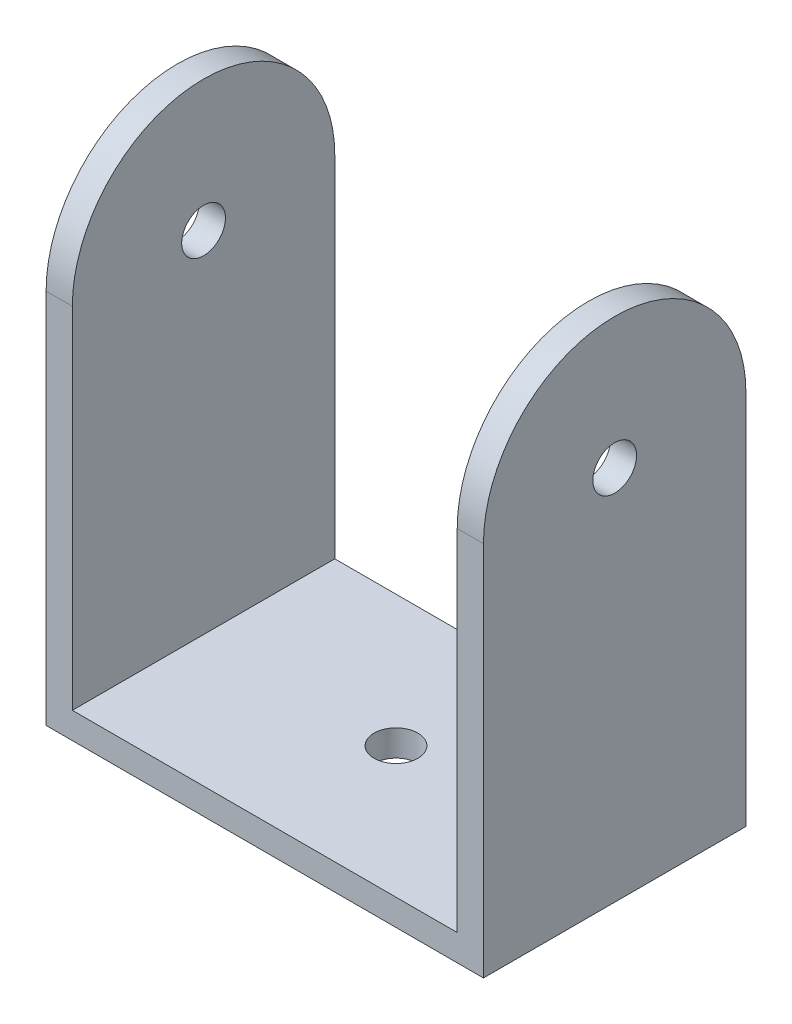
ISO-10303-21;
HEADER;
FILE_DESCRIPTION(('STEP AP214'),'2;1');
FILE_NAME('part.step','',(''),(''),'','','');
FILE_SCHEMA(('AUTOMOTIVE_DESIGN { 1 0 10303 214 1 1 1 1 }'));
ENDSEC;
DATA;
#1=APPLICATION_CONTEXT('core data for automotive mechanical design processes');
#2=APPLICATION_PROTOCOL_DEFINITION('international standard','automotive_design',2000,#1);
#3=PRODUCT_CONTEXT('',#1,'mechanical');
#4=PRODUCT('Part','Part','',(#3));
#5=PRODUCT_RELATED_PRODUCT_CATEGORY('part','',(#4));
#6=PRODUCT_DEFINITION_FORMATION('','',#4);
#7=PRODUCT_DEFINITION_CONTEXT('part definition',#1,'design');
#8=PRODUCT_DEFINITION('design','',#6,#7);
#9=PRODUCT_DEFINITION_SHAPE('','',#8);
#10=(LENGTH_UNIT() NAMED_UNIT(*) SI_UNIT(.MILLI.,.METRE.));
#11=(NAMED_UNIT(*) PLANE_ANGLE_UNIT() SI_UNIT($,.RADIAN.));
#12=(NAMED_UNIT(*) SI_UNIT($,.STERADIAN.) SOLID_ANGLE_UNIT());
#13=UNCERTAINTY_MEASURE_WITH_UNIT(LENGTH_MEASURE(1.E-05),#10,'distance_accuracy_value','');
#14=(GEOMETRIC_REPRESENTATION_CONTEXT(3) GLOBAL_UNCERTAINTY_ASSIGNED_CONTEXT((#13)) GLOBAL_UNIT_ASSIGNED_CONTEXT((#10,
#11,#12)) REPRESENTATION_CONTEXT('',''));
#15=CARTESIAN_POINT('',(0.,0.,0.));
#16=DIRECTION('',(0.,0.,1.));
#17=DIRECTION('',(1.,0.,0.));
#18=AXIS2_PLACEMENT_3D('',#15,#16,#17);
#19=CARTESIAN_POINT('',(0.,3.,0.));
#20=DIRECTION('',(0.,1.,0.));
#21=DIRECTION('',(0.,0.,1.));
#22=AXIS2_PLACEMENT_3D('',#19,#20,#21);
#23=PLANE('',#22);
#24=CARTESIAN_POINT('',(0.,3.,0.));
#25=DIRECTION('',(0.,1.,0.));
#26=DIRECTION('',(0.,0.,1.));
#27=AXIS2_PLACEMENT_3D('',#24,#25,#26);
#28=CIRCLE('',#27,2.5);
#29=CARTESIAN_POINT('',(0.,3.,2.5));
#30=VERTEX_POINT('',#29);
#31=EDGE_CURVE('E209',#30,#30,#28,.T.);
#32=ORIENTED_EDGE('',*,*,#31,.F.);
#33=EDGE_LOOP('',(#32));
#34=FACE_BOUND('',#33,.T.);
#35=DIRECTION('',(-1.,0.,0.));
#36=VECTOR('',#35,1.);
#37=CARTESIAN_POINT('',(-25.,3.,-15.));
#38=LINE('',#37,#36);
#39=CARTESIAN_POINT('',(22.,3.,-15.));
#40=VERTEX_POINT('',#39);
#41=CARTESIAN_POINT('',(-22.,3.,-15.));
#42=VERTEX_POINT('',#41);
#43=EDGE_CURVE('E55',#40,#42,#38,.T.);
#44=ORIENTED_EDGE('',*,*,#43,.T.);
#45=DIRECTION('',(0.,0.,-1.));
#46=VECTOR('',#45,1.);
#47=CARTESIAN_POINT('',(-22.,3.,-15.));
#48=LINE('',#47,#46);
#49=CARTESIAN_POINT('',(-22.,3.,15.));
#50=VERTEX_POINT('',#49);
#51=EDGE_CURVE('E50',#50,#42,#48,.T.);
#52=ORIENTED_EDGE('',*,*,#51,.F.);
#53=DIRECTION('',(1.,0.,0.));
#54=VECTOR('',#53,1.);
#55=CARTESIAN_POINT('',(-25.,3.,15.));
#56=LINE('',#55,#54);
#57=CARTESIAN_POINT('',(22.,3.,15.));
#58=VERTEX_POINT('',#57);
#59=EDGE_CURVE('E36',#50,#58,#56,.T.);
#60=ORIENTED_EDGE('',*,*,#59,.T.);
#61=DIRECTION('',(0.,0.,-1.));
#62=VECTOR('',#61,1.);
#63=CARTESIAN_POINT('',(22.,3.,-15.));
#64=LINE('',#63,#62);
#65=EDGE_CURVE('E142',#58,#40,#64,.T.);
#66=ORIENTED_EDGE('',*,*,#65,.T.);
#67=EDGE_LOOP('',(#44,#52,#60,#66));
#68=FACE_BOUND('',#67,.T.);
#69=ADVANCED_FACE('F32',(#34,#68),#23,.T.);
#70=CARTESIAN_POINT('',(-25.,3.,-15.));
#71=DIRECTION('',(1.,0.,0.));
#72=DIRECTION('',(0.,0.,-1.));
#73=AXIS2_PLACEMENT_3D('',#70,#71,#72);
#74=PLANE('',#73);
#75=DIRECTION('',(0.,0.,1.));
#76=VECTOR('',#75,1.);
#77=CARTESIAN_POINT('',(-25.,0.,-15.));
#78=LINE('',#77,#76);
#79=CARTESIAN_POINT('',(-25.,0.,-15.));
#80=VERTEX_POINT('',#79);
#81=CARTESIAN_POINT('',(-25.,0.,15.));
#82=VERTEX_POINT('',#81);
#83=EDGE_CURVE('E193',#80,#82,#78,.T.);
#84=ORIENTED_EDGE('',*,*,#83,.T.);
#85=DIRECTION('',(0.,-1.,0.));
#86=VECTOR('',#85,1.);
#87=CARTESIAN_POINT('',(-25.,3.,15.));
#88=LINE('',#87,#86);
#89=CARTESIAN_POINT('',(-25.,43.,15.));
#90=VERTEX_POINT('',#89);
#91=EDGE_CURVE('E11',#90,#82,#88,.T.);
#92=ORIENTED_EDGE('',*,*,#91,.F.);
#93=CARTESIAN_POINT('',(-25.,43.,0.));
#94=DIRECTION('',(1.,0.,0.));
#95=DIRECTION('',(0.,0.,-1.));
#96=AXIS2_PLACEMENT_3D('',#93,#94,#95);
#97=CIRCLE('',#96,15.);
#98=CARTESIAN_POINT('',(-25.,43.,-15.));
#99=VERTEX_POINT('',#98);
#100=EDGE_CURVE('E116',#99,#90,#97,.T.);
#101=ORIENTED_EDGE('',*,*,#100,.F.);
#102=DIRECTION('',(0.,-1.,0.));
#103=VECTOR('',#102,1.);
#104=CARTESIAN_POINT('',(-25.,3.,-15.));
#105=LINE('',#104,#103);
#106=EDGE_CURVE('E170',#99,#80,#105,.T.);
#107=ORIENTED_EDGE('',*,*,#106,.T.);
#108=EDGE_LOOP('',(#84,#92,#101,#107));
#109=FACE_BOUND('',#108,.T.);
#110=CARTESIAN_POINT('',(-25.,43.,0.));
#111=DIRECTION('',(1.,0.,0.));
#112=DIRECTION('',(0.,0.,-1.));
#113=AXIS2_PLACEMENT_3D('',#110,#111,#112);
#114=CIRCLE('',#113,2.5);
#115=CARTESIAN_POINT('',(-25.,43.,-2.5));
#116=VERTEX_POINT('',#115);
#117=EDGE_CURVE('E203',#116,#116,#114,.T.);
#118=ORIENTED_EDGE('',*,*,#117,.T.);
#119=EDGE_LOOP('',(#118));
#120=FACE_BOUND('',#119,.T.);
#121=ADVANCED_FACE('F34',(#109,#120),#74,.F.);
#122=CARTESIAN_POINT('',(-25.,3.,15.));
#123=DIRECTION('',(0.,0.,-1.));
#124=DIRECTION('',(-1.,0.,0.));
#125=AXIS2_PLACEMENT_3D('',#122,#123,#124);
#126=PLANE('',#125);
#127=DIRECTION('',(1.,0.,0.));
#128=VECTOR('',#127,1.);
#129=CARTESIAN_POINT('',(-25.,0.,15.));
#130=LINE('',#129,#128);
#131=CARTESIAN_POINT('',(25.,0.,15.));
#132=VERTEX_POINT('',#131);
#133=EDGE_CURVE('E179',#82,#132,#130,.T.);
#134=ORIENTED_EDGE('',*,*,#133,.T.);
#135=DIRECTION('',(0.,-1.,0.));
#136=VECTOR('',#135,1.);
#137=CARTESIAN_POINT('',(25.,3.,15.));
#138=LINE('',#137,#136);
#139=CARTESIAN_POINT('',(25.,43.,15.));
#140=VERTEX_POINT('',#139);
#141=EDGE_CURVE('E42',#140,#132,#138,.T.);
#142=ORIENTED_EDGE('',*,*,#141,.F.);
#143=DIRECTION('',(1.,0.,0.));
#144=VECTOR('',#143,1.);
#145=CARTESIAN_POINT('',(22.,43.,15.));
#146=LINE('',#145,#144);
#147=CARTESIAN_POINT('',(22.,43.,15.));
#148=VERTEX_POINT('',#147);
#149=EDGE_CURVE('E156',#148,#140,#146,.T.);
#150=ORIENTED_EDGE('',*,*,#149,.F.);
#151=DIRECTION('',(0.,-1.,0.));
#152=VECTOR('',#151,1.);
#153=CARTESIAN_POINT('',(22.,3.,15.));
#154=LINE('',#153,#152);
#155=EDGE_CURVE('E151',#148,#58,#154,.T.);
#156=ORIENTED_EDGE('',*,*,#155,.T.);
#157=ORIENTED_EDGE('',*,*,#59,.F.);
#158=DIRECTION('',(0.,-1.,0.));
#159=VECTOR('',#158,1.);
#160=CARTESIAN_POINT('',(-22.,3.,15.));
#161=LINE('',#160,#159);
#162=CARTESIAN_POINT('',(-22.,43.,15.));
#163=VERTEX_POINT('',#162);
#164=EDGE_CURVE('E105',#163,#50,#161,.T.);
#165=ORIENTED_EDGE('',*,*,#164,.F.);
#166=DIRECTION('',(-1.,0.,0.));
#167=VECTOR('',#166,1.);
#168=CARTESIAN_POINT('',(-22.,43.,15.));
#169=LINE('',#168,#167);
#170=EDGE_CURVE('E113',#163,#90,#169,.T.);
#171=ORIENTED_EDGE('',*,*,#170,.T.);
#172=ORIENTED_EDGE('',*,*,#91,.T.);
#173=EDGE_LOOP('',(#134,#142,#150,#156,#157,#165,#171,#172));
#174=FACE_BOUND('',#173,.T.);
#175=ADVANCED_FACE('F120',(#174),#126,.F.);
#176=CARTESIAN_POINT('',(25.,3.,-15.));
#177=DIRECTION('',(-1.,0.,0.));
#178=DIRECTION('',(0.,0.,1.));
#179=AXIS2_PLACEMENT_3D('',#176,#177,#178);
#180=PLANE('',#179);
#181=DIRECTION('',(0.,0.,-1.));
#182=VECTOR('',#181,1.);
#183=CARTESIAN_POINT('',(25.,0.,-15.));
#184=LINE('',#183,#182);
#185=CARTESIAN_POINT('',(25.,0.,-15.));
#186=VERTEX_POINT('',#185);
#187=EDGE_CURVE('E175',#132,#186,#184,.T.);
#188=ORIENTED_EDGE('',*,*,#187,.T.);
#189=DIRECTION('',(0.,-1.,0.));
#190=VECTOR('',#189,1.);
#191=CARTESIAN_POINT('',(25.,3.,-15.));
#192=LINE('',#191,#190);
#193=CARTESIAN_POINT('',(25.,43.,-15.));
#194=VERTEX_POINT('',#193);
#195=EDGE_CURVE('E172',#194,#186,#192,.T.);
#196=ORIENTED_EDGE('',*,*,#195,.F.);
#197=CARTESIAN_POINT('',(25.,43.,0.));
#198=DIRECTION('',(1.,0.,0.));
#199=DIRECTION('',(0.,0.,-1.));
#200=AXIS2_PLACEMENT_3D('',#197,#198,#199);
#201=CIRCLE('',#200,15.);
#202=EDGE_CURVE('E134',#194,#140,#201,.T.);
#203=ORIENTED_EDGE('',*,*,#202,.T.);
#204=ORIENTED_EDGE('',*,*,#141,.T.);
#205=EDGE_LOOP('',(#188,#196,#203,#204));
#206=FACE_BOUND('',#205,.T.);
#207=CARTESIAN_POINT('',(25.,43.,0.));
#208=DIRECTION('',(1.,0.,0.));
#209=DIRECTION('',(0.,0.,-1.));
#210=AXIS2_PLACEMENT_3D('',#207,#208,#209);
#211=CIRCLE('',#210,2.5);
#212=CARTESIAN_POINT('',(25.,43.,-2.5));
#213=VERTEX_POINT('',#212);
#214=EDGE_CURVE('E129',#213,#213,#211,.T.);
#215=ORIENTED_EDGE('',*,*,#214,.F.);
#216=EDGE_LOOP('',(#215));
#217=FACE_BOUND('',#216,.T.);
#218=ADVANCED_FACE('F187',(#206,#217),#180,.F.);
#219=CARTESIAN_POINT('',(-25.,3.,-15.));
#220=DIRECTION('',(0.,0.,1.));
#221=DIRECTION('',(1.,0.,0.));
#222=AXIS2_PLACEMENT_3D('',#219,#220,#221);
#223=PLANE('',#222);
#224=DIRECTION('',(-1.,0.,0.));
#225=VECTOR('',#224,1.);
#226=CARTESIAN_POINT('',(-25.,0.,-15.));
#227=LINE('',#226,#225);
#228=EDGE_CURVE('E174',#186,#80,#227,.T.);
#229=ORIENTED_EDGE('',*,*,#228,.T.);
#230=ORIENTED_EDGE('',*,*,#106,.F.);
#231=DIRECTION('',(-1.,0.,0.));
#232=VECTOR('',#231,1.);
#233=CARTESIAN_POINT('',(-22.,43.,-15.));
#234=LINE('',#233,#232);
#235=CARTESIAN_POINT('',(-22.,43.,-15.));
#236=VERTEX_POINT('',#235);
#237=EDGE_CURVE('E118',#236,#99,#234,.T.);
#238=ORIENTED_EDGE('',*,*,#237,.F.);
#239=DIRECTION('',(0.,1.,0.));
#240=VECTOR('',#239,1.);
#241=CARTESIAN_POINT('',(-22.,43.,-15.));
#242=LINE('',#241,#240);
#243=EDGE_CURVE('E106',#42,#236,#242,.T.);
#244=ORIENTED_EDGE('',*,*,#243,.F.);
#245=ORIENTED_EDGE('',*,*,#43,.F.);
#246=DIRECTION('',(0.,1.,0.));
#247=VECTOR('',#246,1.);
#248=CARTESIAN_POINT('',(22.,43.,-15.));
#249=LINE('',#248,#247);
#250=CARTESIAN_POINT('',(22.,43.,-15.));
#251=VERTEX_POINT('',#250);
#252=EDGE_CURVE('E145',#40,#251,#249,.T.);
#253=ORIENTED_EDGE('',*,*,#252,.T.);
#254=DIRECTION('',(1.,0.,0.));
#255=VECTOR('',#254,1.);
#256=CARTESIAN_POINT('',(22.,43.,-15.));
#257=LINE('',#256,#255);
#258=EDGE_CURVE('E152',#251,#194,#257,.T.);
#259=ORIENTED_EDGE('',*,*,#258,.T.);
#260=ORIENTED_EDGE('',*,*,#195,.T.);
#261=EDGE_LOOP('',(#229,#230,#238,#244,#245,#253,#259,#260));
#262=FACE_BOUND('',#261,.T.);
#263=ADVANCED_FACE('F169',(#262),#223,.F.);
#264=CARTESIAN_POINT('',(0.,0.,0.));
#265=DIRECTION('',(0.,1.,0.));
#266=DIRECTION('',(0.,0.,1.));
#267=AXIS2_PLACEMENT_3D('',#264,#265,#266);
#268=PLANE('',#267);
#269=CARTESIAN_POINT('',(0.,0.,0.));
#270=DIRECTION('',(0.,1.,0.));
#271=DIRECTION('',(0.,0.,1.));
#272=AXIS2_PLACEMENT_3D('',#269,#270,#271);
#273=CIRCLE('',#272,2.5);
#274=CARTESIAN_POINT('',(0.,0.,2.5));
#275=VERTEX_POINT('',#274);
#276=EDGE_CURVE('E205',#275,#275,#273,.T.);
#277=ORIENTED_EDGE('',*,*,#276,.T.);
#278=EDGE_LOOP('',(#277));
#279=FACE_BOUND('',#278,.T.);
#280=ORIENTED_EDGE('',*,*,#83,.F.);
#281=ORIENTED_EDGE('',*,*,#228,.F.);
#282=ORIENTED_EDGE('',*,*,#187,.F.);
#283=ORIENTED_EDGE('',*,*,#133,.F.);
#284=EDGE_LOOP('',(#280,#281,#282,#283));
#285=FACE_BOUND('',#284,.T.);
#286=ADVANCED_FACE('F191',(#279,#285),#268,.F.);
#287=CARTESIAN_POINT('',(22.,43.,0.));
#288=DIRECTION('',(1.,0.,0.));
#289=DIRECTION('',(0.,0.,-1.));
#290=AXIS2_PLACEMENT_3D('',#287,#288,#289);
#291=CYLINDRICAL_SURFACE('',#290,15.);
#292=ORIENTED_EDGE('',*,*,#202,.F.);
#293=ORIENTED_EDGE('',*,*,#258,.F.);
#294=CARTESIAN_POINT('',(22.,43.,0.));
#295=DIRECTION('',(1.,0.,0.));
#296=DIRECTION('',(0.,0.,-1.));
#297=AXIS2_PLACEMENT_3D('',#294,#295,#296);
#298=CIRCLE('',#297,15.);
#299=EDGE_CURVE('E139',#251,#148,#298,.T.);
#300=ORIENTED_EDGE('',*,*,#299,.T.);
#301=ORIENTED_EDGE('',*,*,#149,.T.);
#302=EDGE_LOOP('',(#292,#293,#300,#301));
#303=FACE_BOUND('',#302,.T.);
#304=ADVANCED_FACE('F163',(#303),#291,.T.);
#305=CARTESIAN_POINT('',(22.,43.,0.));
#306=DIRECTION('',(1.,0.,0.));
#307=DIRECTION('',(0.,0.,-1.));
#308=AXIS2_PLACEMENT_3D('',#305,#306,#307);
#309=PLANE('',#308);
#310=CARTESIAN_POINT('',(22.,43.,0.));
#311=DIRECTION('',(1.,0.,0.));
#312=DIRECTION('',(0.,0.,-1.));
#313=AXIS2_PLACEMENT_3D('',#310,#311,#312);
#314=CIRCLE('',#313,2.5);
#315=CARTESIAN_POINT('',(22.,43.,-2.5));
#316=VERTEX_POINT('',#315);
#317=EDGE_CURVE('E131',#316,#316,#314,.T.);
#318=ORIENTED_EDGE('',*,*,#317,.T.);
#319=EDGE_LOOP('',(#318));
#320=FACE_BOUND('',#319,.T.);
#321=ORIENTED_EDGE('',*,*,#65,.F.);
#322=ORIENTED_EDGE('',*,*,#155,.F.);
#323=ORIENTED_EDGE('',*,*,#299,.F.);
#324=ORIENTED_EDGE('',*,*,#252,.F.);
#325=EDGE_LOOP('',(#321,#322,#323,#324));
#326=FACE_BOUND('',#325,.T.);
#327=ADVANCED_FACE('F167',(#320,#326),#309,.F.);
#328=CARTESIAN_POINT('',(22.,43.,0.));
#329=DIRECTION('',(1.,0.,0.));
#330=DIRECTION('',(0.,0.,-1.));
#331=AXIS2_PLACEMENT_3D('',#328,#329,#330);
#332=CYLINDRICAL_SURFACE('',#331,2.5);
#333=ORIENTED_EDGE('',*,*,#317,.F.);
#334=EDGE_LOOP('',(#333));
#335=FACE_BOUND('',#334,.T.);
#336=ORIENTED_EDGE('',*,*,#214,.T.);
#337=EDGE_LOOP('',(#336));
#338=FACE_BOUND('',#337,.T.);
#339=ADVANCED_FACE('F260',(#335,#338),#332,.F.);
#340=CARTESIAN_POINT('',(-22.,43.,0.));
#341=DIRECTION('',(-1.,0.,0.));
#342=DIRECTION('',(0.,0.,-1.));
#343=AXIS2_PLACEMENT_3D('',#340,#341,#342);
#344=PLANE('',#343);
#345=ORIENTED_EDGE('',*,*,#51,.T.);
#346=ORIENTED_EDGE('',*,*,#243,.T.);
#347=CARTESIAN_POINT('',(-22.,43.,0.));
#348=DIRECTION('',(1.,0.,0.));
#349=DIRECTION('',(0.,0.,-1.));
#350=AXIS2_PLACEMENT_3D('',#347,#348,#349);
#351=CIRCLE('',#350,15.);
#352=EDGE_CURVE('E100',#236,#163,#351,.T.);
#353=ORIENTED_EDGE('',*,*,#352,.T.);
#354=ORIENTED_EDGE('',*,*,#164,.T.);
#355=EDGE_LOOP('',(#345,#346,#353,#354));
#356=FACE_BOUND('',#355,.T.);
#357=CARTESIAN_POINT('',(-22.,43.,0.));
#358=DIRECTION('',(1.,0.,0.));
#359=DIRECTION('',(0.,0.,-1.));
#360=AXIS2_PLACEMENT_3D('',#357,#358,#359);
#361=CIRCLE('',#360,2.5);
#362=CARTESIAN_POINT('',(-22.,43.,-2.5));
#363=VERTEX_POINT('',#362);
#364=EDGE_CURVE('E128',#363,#363,#361,.T.);
#365=ORIENTED_EDGE('',*,*,#364,.F.);
#366=EDGE_LOOP('',(#365));
#367=FACE_BOUND('',#366,.T.);
#368=ADVANCED_FACE('F102',(#356,#367),#344,.F.);
#369=CARTESIAN_POINT('',(-22.,43.,0.));
#370=DIRECTION('',(-1.,0.,0.));
#371=DIRECTION('',(0.,0.,1.));
#372=AXIS2_PLACEMENT_3D('',#369,#370,#371);
#373=CYLINDRICAL_SURFACE('',#372,15.);
#374=ORIENTED_EDGE('',*,*,#100,.T.);
#375=ORIENTED_EDGE('',*,*,#170,.F.);
#376=ORIENTED_EDGE('',*,*,#352,.F.);
#377=ORIENTED_EDGE('',*,*,#237,.T.);
#378=EDGE_LOOP('',(#374,#375,#376,#377));
#379=FACE_BOUND('',#378,.T.);
#380=ADVANCED_FACE('F114',(#379),#373,.T.);
#381=CARTESIAN_POINT('',(-22.,43.,0.));
#382=DIRECTION('',(-1.,0.,0.));
#383=DIRECTION('',(0.,0.,1.));
#384=AXIS2_PLACEMENT_3D('',#381,#382,#383);
#385=CYLINDRICAL_SURFACE('',#384,2.5);
#386=ORIENTED_EDGE('',*,*,#364,.T.);
#387=EDGE_LOOP('',(#386));
#388=FACE_BOUND('',#387,.T.);
#389=ORIENTED_EDGE('',*,*,#117,.F.);
#390=EDGE_LOOP('',(#389));
#391=FACE_BOUND('',#390,.T.);
#392=ADVANCED_FACE('F279',(#388,#391),#385,.F.);
#393=CARTESIAN_POINT('',(0.,0.,0.));
#394=DIRECTION('',(0.,1.,0.));
#395=DIRECTION('',(0.,0.,1.));
#396=AXIS2_PLACEMENT_3D('',#393,#394,#395);
#397=CYLINDRICAL_SURFACE('',#396,2.5);
#398=ORIENTED_EDGE('',*,*,#276,.F.);
#399=EDGE_LOOP('',(#398));
#400=FACE_BOUND('',#399,.T.);
#401=ORIENTED_EDGE('',*,*,#31,.T.);
#402=EDGE_LOOP('',(#401));
#403=FACE_BOUND('',#402,.T.);
#404=ADVANCED_FACE('F215',(#400,#403),#397,.F.);
#405=CLOSED_SHELL('',(#69,#121,#175,#218,#263,#286,#304,#327,#339,#368,#380,#392,#404));
#406=MANIFOLD_SOLID_BREP('B2',#405);
#407=ADVANCED_BREP_SHAPE_REPRESENTATION('',(#18,#406),#14);
#408=SHAPE_DEFINITION_REPRESENTATION(#9,#407);
ENDSEC;
END-ISO-10303-21;
